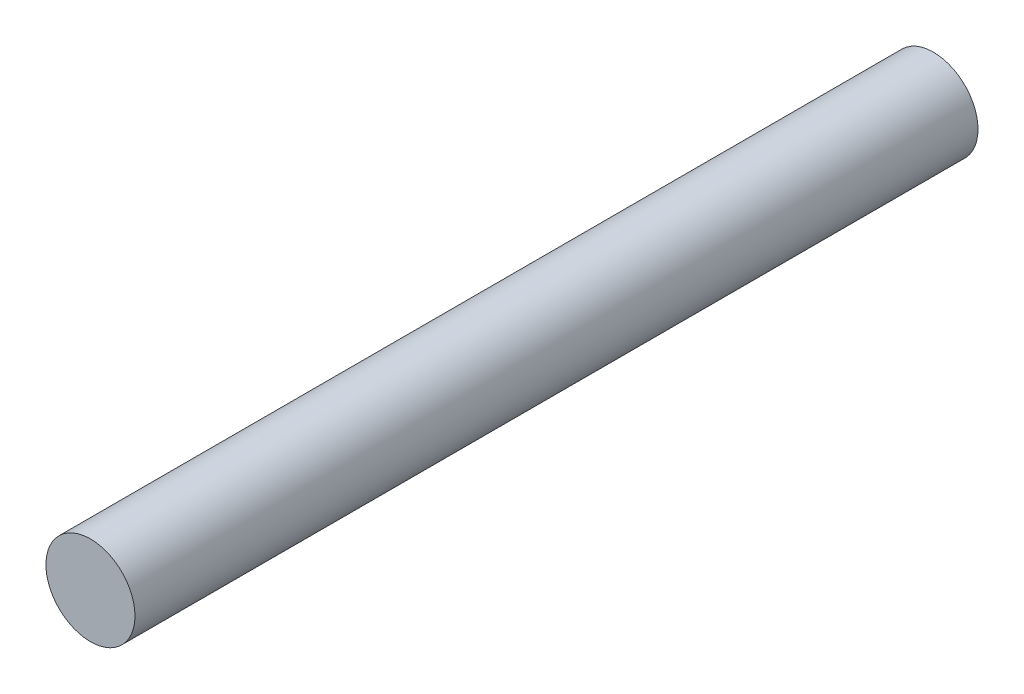
ISO-10303-21;
HEADER;
FILE_DESCRIPTION(('STEP AP214'),'2;1');
FILE_NAME('part.step','',(''),(''),'','','');
FILE_SCHEMA(('AUTOMOTIVE_DESIGN { 1 0 10303 214 1 1 1 1 }'));
ENDSEC;
DATA;
#1=APPLICATION_CONTEXT('core data for automotive mechanical design processes');
#2=APPLICATION_PROTOCOL_DEFINITION('international standard','automotive_design',2000,#1);
#3=PRODUCT_CONTEXT('',#1,'mechanical');
#4=PRODUCT('Part','Part','',(#3));
#5=PRODUCT_RELATED_PRODUCT_CATEGORY('part','',(#4));
#6=PRODUCT_DEFINITION_FORMATION('','',#4);
#7=PRODUCT_DEFINITION_CONTEXT('part definition',#1,'design');
#8=PRODUCT_DEFINITION('design','',#6,#7);
#9=PRODUCT_DEFINITION_SHAPE('','',#8);
#10=(LENGTH_UNIT() NAMED_UNIT(*) SI_UNIT(.MILLI.,.METRE.));
#11=(NAMED_UNIT(*) PLANE_ANGLE_UNIT() SI_UNIT($,.RADIAN.));
#12=(NAMED_UNIT(*) SI_UNIT($,.STERADIAN.) SOLID_ANGLE_UNIT());
#13=UNCERTAINTY_MEASURE_WITH_UNIT(LENGTH_MEASURE(1.E-05),#10,'distance_accuracy_value','');
#14=(GEOMETRIC_REPRESENTATION_CONTEXT(3) GLOBAL_UNCERTAINTY_ASSIGNED_CONTEXT((#13)) GLOBAL_UNIT_ASSIGNED_CONTEXT((#10,
#11,#12)) REPRESENTATION_CONTEXT('',''));
#15=CARTESIAN_POINT('',(0.,0.,0.));
#16=DIRECTION('',(0.,0.,1.));
#17=DIRECTION('',(1.,0.,0.));
#18=AXIS2_PLACEMENT_3D('',#15,#16,#17);
#19=CARTESIAN_POINT('',(0.,0.,170.35));
#20=DIRECTION('',(0.,0.,-1.));
#21=DIRECTION('',(-1.,0.,0.));
#22=AXIS2_PLACEMENT_3D('',#19,#20,#21);
#23=CYLINDRICAL_SURFACE('',#22,9.);
#24=CARTESIAN_POINT('',(0.,0.,170.35));
#25=DIRECTION('',(0.,0.,1.));
#26=DIRECTION('',(1.,0.,0.));
#27=AXIS2_PLACEMENT_3D('',#24,#25,#26);
#28=CIRCLE('',#27,9.);
#29=CARTESIAN_POINT('',(9.,0.,170.35));
#30=VERTEX_POINT('',#29);
#31=EDGE_CURVE('E10',#30,#30,#28,.T.);
#32=ORIENTED_EDGE('',*,*,#31,.F.);
#33=EDGE_LOOP('',(#32));
#34=FACE_BOUND('',#33,.T.);
#35=CARTESIAN_POINT('',(0.,0.,0.));
#36=DIRECTION('',(0.,0.,1.));
#37=DIRECTION('',(1.,0.,0.));
#38=AXIS2_PLACEMENT_3D('',#35,#36,#37);
#39=CIRCLE('',#38,9.);
#40=CARTESIAN_POINT('',(9.,0.,0.));
#41=VERTEX_POINT('',#40);
#42=EDGE_CURVE('E32',#41,#41,#39,.T.);
#43=ORIENTED_EDGE('',*,*,#42,.T.);
#44=EDGE_LOOP('',(#43));
#45=FACE_BOUND('',#44,.T.);
#46=ADVANCED_FACE('F29',(#34,#45),#23,.T.);
#47=CARTESIAN_POINT('',(0.,0.,170.35));
#48=DIRECTION('',(0.,0.,1.));
#49=DIRECTION('',(1.,0.,0.));
#50=AXIS2_PLACEMENT_3D('',#47,#48,#49);
#51=PLANE('',#50);
#52=ORIENTED_EDGE('',*,*,#31,.T.);
#53=EDGE_LOOP('',(#52));
#54=FACE_BOUND('',#53,.T.);
#55=ADVANCED_FACE('F44',(#54),#51,.T.);
#56=CARTESIAN_POINT('',(0.,0.,0.));
#57=DIRECTION('',(0.,0.,1.));
#58=DIRECTION('',(1.,0.,0.));
#59=AXIS2_PLACEMENT_3D('',#56,#57,#58);
#60=PLANE('',#59);
#61=ORIENTED_EDGE('',*,*,#42,.F.);
#62=EDGE_LOOP('',(#61));
#63=FACE_BOUND('',#62,.T.);
#64=ADVANCED_FACE('F42',(#63),#60,.F.);
#65=CLOSED_SHELL('',(#46,#55,#64));
#66=MANIFOLD_SOLID_BREP('B2',#65);
#67=ADVANCED_BREP_SHAPE_REPRESENTATION('',(#18,#66),#14);
#68=SHAPE_DEFINITION_REPRESENTATION(#9,#67);
ENDSEC;
END-ISO-10303-21;
